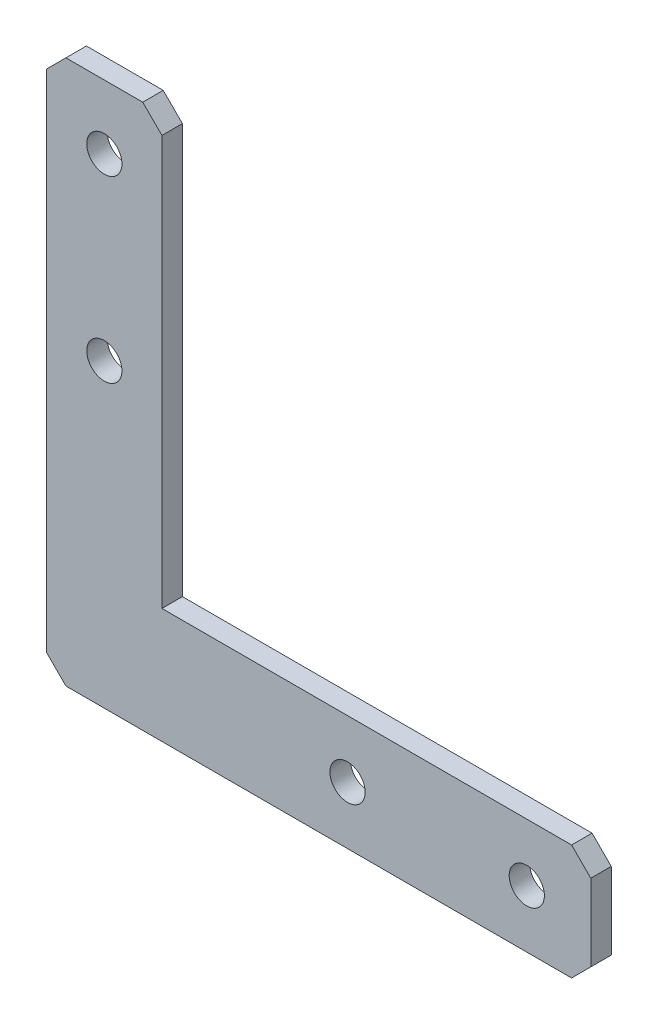
ISO-10303-21;
HEADER;
FILE_DESCRIPTION(('STEP AP214'),'2;1');
FILE_NAME('part.step','',(''),(''),'','','');
FILE_SCHEMA(('AUTOMOTIVE_DESIGN { 1 0 10303 214 1 1 1 1 }'));
ENDSEC;
DATA;
#1=APPLICATION_CONTEXT('core data for automotive mechanical design processes');
#2=APPLICATION_PROTOCOL_DEFINITION('international standard','automotive_design',2000,#1);
#3=PRODUCT_CONTEXT('',#1,'mechanical');
#4=PRODUCT('Part','Part','',(#3));
#5=PRODUCT_RELATED_PRODUCT_CATEGORY('part','',(#4));
#6=PRODUCT_DEFINITION_FORMATION('','',#4);
#7=PRODUCT_DEFINITION_CONTEXT('part definition',#1,'design');
#8=PRODUCT_DEFINITION('design','',#6,#7);
#9=PRODUCT_DEFINITION_SHAPE('','',#8);
#10=(LENGTH_UNIT() NAMED_UNIT(*) SI_UNIT(.MILLI.,.METRE.));
#11=(NAMED_UNIT(*) PLANE_ANGLE_UNIT() SI_UNIT($,.RADIAN.));
#12=(NAMED_UNIT(*) SI_UNIT($,.STERADIAN.) SOLID_ANGLE_UNIT());
#13=UNCERTAINTY_MEASURE_WITH_UNIT(LENGTH_MEASURE(1.E-05),#10,'distance_accuracy_value','');
#14=(GEOMETRIC_REPRESENTATION_CONTEXT(3) GLOBAL_UNCERTAINTY_ASSIGNED_CONTEXT((#13)) GLOBAL_UNIT_ASSIGNED_CONTEXT((#10,
#11,#12)) REPRESENTATION_CONTEXT('',''));
#15=CARTESIAN_POINT('',(0.,0.,0.));
#16=DIRECTION('',(0.,0.,1.));
#17=DIRECTION('',(1.,0.,0.));
#18=AXIS2_PLACEMENT_3D('',#15,#16,#17);
#19=CARTESIAN_POINT('',(3.,85.,-3.2));
#20=DIRECTION('',(-0.707106781186548,0.707106781186547,0.));
#21=DIRECTION('',(-0.707106781186547,-0.707106781186548,0.));
#22=AXIS2_PLACEMENT_3D('',#19,#20,#21);
#23=PLANE('',#22);
#24=DIRECTION('',(-0.707106781186547,-0.707106781186548,0.));
#25=VECTOR('',#24,1.);
#26=CARTESIAN_POINT('',(3.,85.,0.));
#27=LINE('',#26,#25);
#28=CARTESIAN_POINT('',(3.,85.,0.));
#29=VERTEX_POINT('',#28);
#30=CARTESIAN_POINT('',(0.,82.,0.));
#31=VERTEX_POINT('',#30);
#32=EDGE_CURVE('E148',#29,#31,#27,.T.);
#33=ORIENTED_EDGE('',*,*,#32,.F.);
#34=DIRECTION('',(0.,0.,1.));
#35=VECTOR('',#34,1.);
#36=CARTESIAN_POINT('',(3.,85.,-3.2));
#37=LINE('',#36,#35);
#38=CARTESIAN_POINT('',(3.,85.,-3.2));
#39=VERTEX_POINT('',#38);
#40=EDGE_CURVE('E11',#39,#29,#37,.T.);
#41=ORIENTED_EDGE('',*,*,#40,.F.);
#42=DIRECTION('',(-0.707106781186547,-0.707106781186548,0.));
#43=VECTOR('',#42,1.);
#44=CARTESIAN_POINT('',(3.,85.,-3.2));
#45=LINE('',#44,#43);
#46=CARTESIAN_POINT('',(0.,82.,-3.2));
#47=VERTEX_POINT('',#46);
#48=EDGE_CURVE('E178',#39,#47,#45,.T.);
#49=ORIENTED_EDGE('',*,*,#48,.T.);
#50=DIRECTION('',(0.,0.,1.));
#51=VECTOR('',#50,1.);
#52=CARTESIAN_POINT('',(0.,82.,-3.2));
#53=LINE('',#52,#51);
#54=EDGE_CURVE('E36',#47,#31,#53,.T.);
#55=ORIENTED_EDGE('',*,*,#54,.T.);
#56=EDGE_LOOP('',(#33,#41,#49,#55));
#57=FACE_BOUND('',#56,.T.);
#58=ADVANCED_FACE('F33',(#57),#23,.T.);
#59=CARTESIAN_POINT('',(15.,85.,-3.2));
#60=DIRECTION('',(0.,1.,0.));
#61=DIRECTION('',(0.,0.,1.));
#62=AXIS2_PLACEMENT_3D('',#59,#60,#61);
#63=PLANE('',#62);
#64=DIRECTION('',(-1.,0.,0.));
#65=VECTOR('',#64,1.);
#66=CARTESIAN_POINT('',(15.,85.,0.));
#67=LINE('',#66,#65);
#68=CARTESIAN_POINT('',(15.,85.,0.));
#69=VERTEX_POINT('',#68);
#70=EDGE_CURVE('E176',#69,#29,#67,.T.);
#71=ORIENTED_EDGE('',*,*,#70,.F.);
#72=DIRECTION('',(0.,0.,1.));
#73=VECTOR('',#72,1.);
#74=CARTESIAN_POINT('',(15.,85.,-3.2));
#75=LINE('',#74,#73);
#76=CARTESIAN_POINT('',(15.,85.,-3.2));
#77=VERTEX_POINT('',#76);
#78=EDGE_CURVE('E42',#77,#69,#75,.T.);
#79=ORIENTED_EDGE('',*,*,#78,.F.);
#80=DIRECTION('',(-1.,0.,0.));
#81=VECTOR('',#80,1.);
#82=CARTESIAN_POINT('',(15.,85.,-3.2));
#83=LINE('',#82,#81);
#84=EDGE_CURVE('E138',#77,#39,#83,.T.);
#85=ORIENTED_EDGE('',*,*,#84,.T.);
#86=ORIENTED_EDGE('',*,*,#40,.T.);
#87=EDGE_LOOP('',(#71,#79,#85,#86));
#88=FACE_BOUND('',#87,.T.);
#89=ADVANCED_FACE('F196',(#88),#63,.T.);
#90=CARTESIAN_POINT('',(18.,82.,-3.2));
#91=DIRECTION('',(0.707106781186548,0.707106781186547,0.));
#92=DIRECTION('',(-0.707106781186547,0.707106781186548,0.));
#93=AXIS2_PLACEMENT_3D('',#90,#91,#92);
#94=PLANE('',#93);
#95=DIRECTION('',(-0.707106781186547,0.707106781186548,0.));
#96=VECTOR('',#95,1.);
#97=CARTESIAN_POINT('',(18.,82.,0.));
#98=LINE('',#97,#96);
#99=CARTESIAN_POINT('',(18.,82.,0.));
#100=VERTEX_POINT('',#99);
#101=EDGE_CURVE('E125',#100,#69,#98,.T.);
#102=ORIENTED_EDGE('',*,*,#101,.F.);
#103=DIRECTION('',(0.,0.,1.));
#104=VECTOR('',#103,1.);
#105=CARTESIAN_POINT('',(18.,82.,-3.2));
#106=LINE('',#105,#104);
#107=CARTESIAN_POINT('',(18.,82.,-3.2));
#108=VERTEX_POINT('',#107);
#109=EDGE_CURVE('E120',#108,#100,#106,.T.);
#110=ORIENTED_EDGE('',*,*,#109,.F.);
#111=DIRECTION('',(-0.707106781186547,0.707106781186548,0.));
#112=VECTOR('',#111,1.);
#113=CARTESIAN_POINT('',(18.,82.,-3.2));
#114=LINE('',#113,#112);
#115=EDGE_CURVE('E123',#108,#77,#114,.T.);
#116=ORIENTED_EDGE('',*,*,#115,.T.);
#117=ORIENTED_EDGE('',*,*,#78,.T.);
#118=EDGE_LOOP('',(#102,#110,#116,#117));
#119=FACE_BOUND('',#118,.T.);
#120=ADVANCED_FACE('F122',(#119),#94,.T.);
#121=CARTESIAN_POINT('',(18.,18.,-3.2));
#122=DIRECTION('',(1.,0.,0.));
#123=DIRECTION('',(0.,0.,-1.));
#124=AXIS2_PLACEMENT_3D('',#121,#122,#123);
#125=PLANE('',#124);
#126=DIRECTION('',(0.,1.,0.));
#127=VECTOR('',#126,1.);
#128=CARTESIAN_POINT('',(18.,18.,0.));
#129=LINE('',#128,#127);
#130=CARTESIAN_POINT('',(18.,18.,0.));
#131=VERTEX_POINT('',#130);
#132=EDGE_CURVE('E173',#131,#100,#129,.T.);
#133=ORIENTED_EDGE('',*,*,#132,.F.);
#134=DIRECTION('',(0.,0.,1.));
#135=VECTOR('',#134,1.);
#136=CARTESIAN_POINT('',(18.,18.,-3.2));
#137=LINE('',#136,#135);
#138=CARTESIAN_POINT('',(18.,18.,-3.2));
#139=VERTEX_POINT('',#138);
#140=EDGE_CURVE('E130',#139,#131,#137,.T.);
#141=ORIENTED_EDGE('',*,*,#140,.F.);
#142=DIRECTION('',(0.,1.,0.));
#143=VECTOR('',#142,1.);
#144=CARTESIAN_POINT('',(18.,18.,-3.2));
#145=LINE('',#144,#143);
#146=EDGE_CURVE('E136',#139,#108,#145,.T.);
#147=ORIENTED_EDGE('',*,*,#146,.T.);
#148=ORIENTED_EDGE('',*,*,#109,.T.);
#149=EDGE_LOOP('',(#133,#141,#147,#148));
#150=FACE_BOUND('',#149,.T.);
#151=ADVANCED_FACE('F140',(#150),#125,.T.);
#152=CARTESIAN_POINT('',(82.,18.,-3.2));
#153=DIRECTION('',(0.,1.,0.));
#154=DIRECTION('',(0.,0.,1.));
#155=AXIS2_PLACEMENT_3D('',#152,#153,#154);
#156=PLANE('',#155);
#157=DIRECTION('',(-1.,0.,0.));
#158=VECTOR('',#157,1.);
#159=CARTESIAN_POINT('',(82.,18.,0.));
#160=LINE('',#159,#158);
#161=CARTESIAN_POINT('',(82.,18.,0.));
#162=VERTEX_POINT('',#161);
#163=EDGE_CURVE('E170',#162,#131,#160,.T.);
#164=ORIENTED_EDGE('',*,*,#163,.F.);
#165=DIRECTION('',(0.,0.,1.));
#166=VECTOR('',#165,1.);
#167=CARTESIAN_POINT('',(82.,18.,-3.2));
#168=LINE('',#167,#166);
#169=CARTESIAN_POINT('',(82.,18.,-3.2));
#170=VERTEX_POINT('',#169);
#171=EDGE_CURVE('E182',#170,#162,#168,.T.);
#172=ORIENTED_EDGE('',*,*,#171,.F.);
#173=DIRECTION('',(-1.,0.,0.));
#174=VECTOR('',#173,1.);
#175=CARTESIAN_POINT('',(82.,18.,-3.2));
#176=LINE('',#175,#174);
#177=EDGE_CURVE('E141',#170,#139,#176,.T.);
#178=ORIENTED_EDGE('',*,*,#177,.T.);
#179=ORIENTED_EDGE('',*,*,#140,.T.);
#180=EDGE_LOOP('',(#164,#172,#178,#179));
#181=FACE_BOUND('',#180,.T.);
#182=ADVANCED_FACE('F209',(#181),#156,.T.);
#183=CARTESIAN_POINT('',(85.,15.,-3.2));
#184=DIRECTION('',(0.707106781186547,0.707106781186548,0.));
#185=DIRECTION('',(-0.707106781186548,0.707106781186547,0.));
#186=AXIS2_PLACEMENT_3D('',#183,#184,#185);
#187=PLANE('',#186);
#188=DIRECTION('',(-0.707106781186548,0.707106781186547,0.));
#189=VECTOR('',#188,1.);
#190=CARTESIAN_POINT('',(85.,15.,0.));
#191=LINE('',#190,#189);
#192=CARTESIAN_POINT('',(85.,15.,0.));
#193=VERTEX_POINT('',#192);
#194=EDGE_CURVE('E167',#193,#162,#191,.T.);
#195=ORIENTED_EDGE('',*,*,#194,.F.);
#196=DIRECTION('',(0.,0.,1.));
#197=VECTOR('',#196,1.);
#198=CARTESIAN_POINT('',(85.,15.,-3.2));
#199=LINE('',#198,#197);
#200=CARTESIAN_POINT('',(85.,15.,-3.2));
#201=VERTEX_POINT('',#200);
#202=EDGE_CURVE('E184',#201,#193,#199,.T.);
#203=ORIENTED_EDGE('',*,*,#202,.F.);
#204=DIRECTION('',(-0.707106781186548,0.707106781186547,0.));
#205=VECTOR('',#204,1.);
#206=CARTESIAN_POINT('',(85.,15.,-3.2));
#207=LINE('',#206,#205);
#208=EDGE_CURVE('E143',#201,#170,#207,.T.);
#209=ORIENTED_EDGE('',*,*,#208,.T.);
#210=ORIENTED_EDGE('',*,*,#171,.T.);
#211=EDGE_LOOP('',(#195,#203,#209,#210));
#212=FACE_BOUND('',#211,.T.);
#213=ADVANCED_FACE('F212',(#212),#187,.T.);
#214=CARTESIAN_POINT('',(85.,3.,-3.2));
#215=DIRECTION('',(1.,0.,0.));
#216=DIRECTION('',(0.,0.,-1.));
#217=AXIS2_PLACEMENT_3D('',#214,#215,#216);
#218=PLANE('',#217);
#219=DIRECTION('',(0.,1.,0.));
#220=VECTOR('',#219,1.);
#221=CARTESIAN_POINT('',(85.,3.,0.));
#222=LINE('',#221,#220);
#223=CARTESIAN_POINT('',(85.,3.,0.));
#224=VERTEX_POINT('',#223);
#225=EDGE_CURVE('E164',#224,#193,#222,.T.);
#226=ORIENTED_EDGE('',*,*,#225,.F.);
#227=DIRECTION('',(0.,0.,1.));
#228=VECTOR('',#227,1.);
#229=CARTESIAN_POINT('',(85.,3.,-3.2));
#230=LINE('',#229,#228);
#231=CARTESIAN_POINT('',(85.,3.,-3.2));
#232=VERTEX_POINT('',#231);
#233=EDGE_CURVE('E186',#232,#224,#230,.T.);
#234=ORIENTED_EDGE('',*,*,#233,.F.);
#235=DIRECTION('',(0.,1.,0.));
#236=VECTOR('',#235,1.);
#237=CARTESIAN_POINT('',(85.,3.,-3.2));
#238=LINE('',#237,#236);
#239=EDGE_CURVE('E299',#232,#201,#238,.T.);
#240=ORIENTED_EDGE('',*,*,#239,.T.);
#241=ORIENTED_EDGE('',*,*,#202,.T.);
#242=EDGE_LOOP('',(#226,#234,#240,#241));
#243=FACE_BOUND('',#242,.T.);
#244=ADVANCED_FACE('F216',(#243),#218,.T.);
#245=CARTESIAN_POINT('',(82.,0.,-3.2));
#246=DIRECTION('',(0.707106781186547,-0.707106781186548,0.));
#247=DIRECTION('',(0.707106781186548,0.707106781186547,0.));
#248=AXIS2_PLACEMENT_3D('',#245,#246,#247);
#249=PLANE('',#248);
#250=DIRECTION('',(0.707106781186548,0.707106781186547,0.));
#251=VECTOR('',#250,1.);
#252=CARTESIAN_POINT('',(82.,0.,0.));
#253=LINE('',#252,#251);
#254=CARTESIAN_POINT('',(82.,0.,0.));
#255=VERTEX_POINT('',#254);
#256=EDGE_CURVE('E161',#255,#224,#253,.T.);
#257=ORIENTED_EDGE('',*,*,#256,.F.);
#258=DIRECTION('',(0.,0.,1.));
#259=VECTOR('',#258,1.);
#260=CARTESIAN_POINT('',(82.,0.,-3.2));
#261=LINE('',#260,#259);
#262=CARTESIAN_POINT('',(82.,0.,-3.2));
#263=VERTEX_POINT('',#262);
#264=EDGE_CURVE('E188',#263,#255,#261,.T.);
#265=ORIENTED_EDGE('',*,*,#264,.F.);
#266=DIRECTION('',(0.707106781186548,0.707106781186547,0.));
#267=VECTOR('',#266,1.);
#268=CARTESIAN_POINT('',(82.,0.,-3.2));
#269=LINE('',#268,#267);
#270=EDGE_CURVE('E296',#263,#232,#269,.T.);
#271=ORIENTED_EDGE('',*,*,#270,.T.);
#272=ORIENTED_EDGE('',*,*,#233,.T.);
#273=EDGE_LOOP('',(#257,#265,#271,#272));
#274=FACE_BOUND('',#273,.T.);
#275=ADVANCED_FACE('F220',(#274),#249,.T.);
#276=CARTESIAN_POINT('',(3.,0.,-3.2));
#277=DIRECTION('',(0.,-1.,0.));
#278=DIRECTION('',(0.,0.,-1.));
#279=AXIS2_PLACEMENT_3D('',#276,#277,#278);
#280=PLANE('',#279);
#281=DIRECTION('',(1.,0.,0.));
#282=VECTOR('',#281,1.);
#283=CARTESIAN_POINT('',(3.,0.,0.));
#284=LINE('',#283,#282);
#285=CARTESIAN_POINT('',(3.,0.,0.));
#286=VERTEX_POINT('',#285);
#287=EDGE_CURVE('E158',#286,#255,#284,.T.);
#288=ORIENTED_EDGE('',*,*,#287,.F.);
#289=DIRECTION('',(0.,0.,1.));
#290=VECTOR('',#289,1.);
#291=CARTESIAN_POINT('',(3.,0.,-3.2));
#292=LINE('',#291,#290);
#293=CARTESIAN_POINT('',(3.,0.,-3.2));
#294=VERTEX_POINT('',#293);
#295=EDGE_CURVE('E190',#294,#286,#292,.T.);
#296=ORIENTED_EDGE('',*,*,#295,.F.);
#297=DIRECTION('',(1.,0.,0.));
#298=VECTOR('',#297,1.);
#299=CARTESIAN_POINT('',(3.,0.,-3.2));
#300=LINE('',#299,#298);
#301=EDGE_CURVE('E293',#294,#263,#300,.T.);
#302=ORIENTED_EDGE('',*,*,#301,.T.);
#303=ORIENTED_EDGE('',*,*,#264,.T.);
#304=EDGE_LOOP('',(#288,#296,#302,#303));
#305=FACE_BOUND('',#304,.T.);
#306=ADVANCED_FACE('F224',(#305),#280,.T.);
#307=CARTESIAN_POINT('',(0.,3.,-3.2));
#308=DIRECTION('',(-0.707106781186548,-0.707106781186548,0.));
#309=DIRECTION('',(0.707106781186548,-0.707106781186548,0.));
#310=AXIS2_PLACEMENT_3D('',#307,#308,#309);
#311=PLANE('',#310);
#312=DIRECTION('',(0.707106781186548,-0.707106781186548,0.));
#313=VECTOR('',#312,1.);
#314=CARTESIAN_POINT('',(0.,3.,0.));
#315=LINE('',#314,#313);
#316=CARTESIAN_POINT('',(0.,3.,0.));
#317=VERTEX_POINT('',#316);
#318=EDGE_CURVE('E155',#317,#286,#315,.T.);
#319=ORIENTED_EDGE('',*,*,#318,.F.);
#320=DIRECTION('',(0.,0.,1.));
#321=VECTOR('',#320,1.);
#322=CARTESIAN_POINT('',(0.,3.,-3.2));
#323=LINE('',#322,#321);
#324=CARTESIAN_POINT('',(0.,3.,-3.2));
#325=VERTEX_POINT('',#324);
#326=EDGE_CURVE('E191',#325,#317,#323,.T.);
#327=ORIENTED_EDGE('',*,*,#326,.F.);
#328=DIRECTION('',(0.707106781186548,-0.707106781186548,0.));
#329=VECTOR('',#328,1.);
#330=CARTESIAN_POINT('',(0.,3.,-3.2));
#331=LINE('',#330,#329);
#332=EDGE_CURVE('E290',#325,#294,#331,.T.);
#333=ORIENTED_EDGE('',*,*,#332,.T.);
#334=ORIENTED_EDGE('',*,*,#295,.T.);
#335=EDGE_LOOP('',(#319,#327,#333,#334));
#336=FACE_BOUND('',#335,.T.);
#337=ADVANCED_FACE('F228',(#336),#311,.T.);
#338=CARTESIAN_POINT('',(0.,82.,-3.2));
#339=DIRECTION('',(-1.,0.,0.));
#340=DIRECTION('',(0.,0.,1.));
#341=AXIS2_PLACEMENT_3D('',#338,#339,#340);
#342=PLANE('',#341);
#343=DIRECTION('',(0.,-1.,0.));
#344=VECTOR('',#343,1.);
#345=CARTESIAN_POINT('',(0.,82.,0.));
#346=LINE('',#345,#344);
#347=EDGE_CURVE('E151',#31,#317,#346,.T.);
#348=ORIENTED_EDGE('',*,*,#347,.F.);
#349=ORIENTED_EDGE('',*,*,#54,.F.);
#350=DIRECTION('',(0.,-1.,0.));
#351=VECTOR('',#350,1.);
#352=CARTESIAN_POINT('',(0.,82.,-3.2));
#353=LINE('',#352,#351);
#354=EDGE_CURVE('E288',#47,#325,#353,.T.);
#355=ORIENTED_EDGE('',*,*,#354,.T.);
#356=ORIENTED_EDGE('',*,*,#326,.T.);
#357=EDGE_LOOP('',(#348,#349,#355,#356));
#358=FACE_BOUND('',#357,.T.);
#359=ADVANCED_FACE('F193',(#358),#342,.T.);
#360=CARTESIAN_POINT('',(0.,0.,-3.2));
#361=DIRECTION('',(0.,0.,1.));
#362=DIRECTION('',(1.,0.,0.));
#363=AXIS2_PLACEMENT_3D('',#360,#361,#362);
#364=PLANE('',#363);
#365=CARTESIAN_POINT('',(9.,75.,-3.2));
#366=DIRECTION('',(0.,0.,1.));
#367=DIRECTION('',(1.,0.,0.));
#368=AXIS2_PLACEMENT_3D('',#365,#366,#367);
#369=CIRCLE('',#368,2.75);
#370=CARTESIAN_POINT('',(11.75,75.,-3.2));
#371=VERTEX_POINT('',#370);
#372=EDGE_CURVE('E263',#371,#371,#369,.T.);
#373=ORIENTED_EDGE('',*,*,#372,.T.);
#374=EDGE_LOOP('',(#373));
#375=FACE_BOUND('',#374,.T.);
#376=CARTESIAN_POINT('',(9.,47.,-3.2));
#377=DIRECTION('',(0.,0.,1.));
#378=DIRECTION('',(1.,0.,0.));
#379=AXIS2_PLACEMENT_3D('',#376,#377,#378);
#380=CIRCLE('',#379,2.75);
#381=CARTESIAN_POINT('',(11.75,47.,-3.2));
#382=VERTEX_POINT('',#381);
#383=EDGE_CURVE('E271',#382,#382,#380,.T.);
#384=ORIENTED_EDGE('',*,*,#383,.T.);
#385=EDGE_LOOP('',(#384));
#386=FACE_BOUND('',#385,.T.);
#387=CARTESIAN_POINT('',(47.,9.,-3.2));
#388=DIRECTION('',(0.,0.,1.));
#389=DIRECTION('',(1.,0.,0.));
#390=AXIS2_PLACEMENT_3D('',#387,#388,#389);
#391=CIRCLE('',#390,2.75);
#392=CARTESIAN_POINT('',(49.75,9.,-3.2));
#393=VERTEX_POINT('',#392);
#394=EDGE_CURVE('E277',#393,#393,#391,.T.);
#395=ORIENTED_EDGE('',*,*,#394,.T.);
#396=EDGE_LOOP('',(#395));
#397=FACE_BOUND('',#396,.T.);
#398=CARTESIAN_POINT('',(75.,9.,-3.2));
#399=DIRECTION('',(0.,0.,1.));
#400=DIRECTION('',(1.,0.,0.));
#401=AXIS2_PLACEMENT_3D('',#398,#399,#400);
#402=CIRCLE('',#401,2.75);
#403=CARTESIAN_POINT('',(77.75,9.,-3.2));
#404=VERTEX_POINT('',#403);
#405=EDGE_CURVE('E152',#404,#404,#402,.T.);
#406=ORIENTED_EDGE('',*,*,#405,.T.);
#407=EDGE_LOOP('',(#406));
#408=FACE_BOUND('',#407,.T.);
#409=ORIENTED_EDGE('',*,*,#48,.F.);
#410=ORIENTED_EDGE('',*,*,#84,.F.);
#411=ORIENTED_EDGE('',*,*,#115,.F.);
#412=ORIENTED_EDGE('',*,*,#146,.F.);
#413=ORIENTED_EDGE('',*,*,#177,.F.);
#414=ORIENTED_EDGE('',*,*,#208,.F.);
#415=ORIENTED_EDGE('',*,*,#239,.F.);
#416=ORIENTED_EDGE('',*,*,#270,.F.);
#417=ORIENTED_EDGE('',*,*,#301,.F.);
#418=ORIENTED_EDGE('',*,*,#332,.F.);
#419=ORIENTED_EDGE('',*,*,#354,.F.);
#420=EDGE_LOOP('',(#409,#410,#411,#412,#413,#414,#415,#416,#417,#418,#419));
#421=FACE_BOUND('',#420,.T.);
#422=ADVANCED_FACE('F134',(#375,#386,#397,#408,#421),#364,.F.);
#423=CARTESIAN_POINT('',(0.,0.,0.));
#424=DIRECTION('',(0.,0.,1.));
#425=DIRECTION('',(1.,0.,0.));
#426=AXIS2_PLACEMENT_3D('',#423,#424,#425);
#427=PLANE('',#426);
#428=CARTESIAN_POINT('',(9.,75.,0.));
#429=DIRECTION('',(0.,0.,1.));
#430=DIRECTION('',(1.,0.,0.));
#431=AXIS2_PLACEMENT_3D('',#428,#429,#430);
#432=CIRCLE('',#431,2.75);
#433=CARTESIAN_POINT('',(11.75,75.,0.));
#434=VERTEX_POINT('',#433);
#435=EDGE_CURVE('E266',#434,#434,#432,.T.);
#436=ORIENTED_EDGE('',*,*,#435,.F.);
#437=EDGE_LOOP('',(#436));
#438=FACE_BOUND('',#437,.T.);
#439=CARTESIAN_POINT('',(9.,47.,0.));
#440=DIRECTION('',(0.,0.,1.));
#441=DIRECTION('',(1.,0.,0.));
#442=AXIS2_PLACEMENT_3D('',#439,#440,#441);
#443=CIRCLE('',#442,2.75);
#444=CARTESIAN_POINT('',(11.75,47.,0.));
#445=VERTEX_POINT('',#444);
#446=EDGE_CURVE('E268',#445,#445,#443,.T.);
#447=ORIENTED_EDGE('',*,*,#446,.F.);
#448=EDGE_LOOP('',(#447));
#449=FACE_BOUND('',#448,.T.);
#450=CARTESIAN_POINT('',(47.,9.,0.));
#451=DIRECTION('',(0.,0.,1.));
#452=DIRECTION('',(1.,0.,0.));
#453=AXIS2_PLACEMENT_3D('',#450,#451,#452);
#454=CIRCLE('',#453,2.75);
#455=CARTESIAN_POINT('',(49.75,9.,0.));
#456=VERTEX_POINT('',#455);
#457=EDGE_CURVE('E274',#456,#456,#454,.T.);
#458=ORIENTED_EDGE('',*,*,#457,.F.);
#459=EDGE_LOOP('',(#458));
#460=FACE_BOUND('',#459,.T.);
#461=CARTESIAN_POINT('',(75.,9.,0.));
#462=DIRECTION('',(0.,0.,1.));
#463=DIRECTION('',(1.,0.,0.));
#464=AXIS2_PLACEMENT_3D('',#461,#462,#463);
#465=CIRCLE('',#464,2.75);
#466=CARTESIAN_POINT('',(77.75,9.,0.));
#467=VERTEX_POINT('',#466);
#468=EDGE_CURVE('E280',#467,#467,#465,.T.);
#469=ORIENTED_EDGE('',*,*,#468,.F.);
#470=EDGE_LOOP('',(#469));
#471=FACE_BOUND('',#470,.T.);
#472=ORIENTED_EDGE('',*,*,#32,.T.);
#473=ORIENTED_EDGE('',*,*,#347,.T.);
#474=ORIENTED_EDGE('',*,*,#318,.T.);
#475=ORIENTED_EDGE('',*,*,#287,.T.);
#476=ORIENTED_EDGE('',*,*,#256,.T.);
#477=ORIENTED_EDGE('',*,*,#225,.T.);
#478=ORIENTED_EDGE('',*,*,#194,.T.);
#479=ORIENTED_EDGE('',*,*,#163,.T.);
#480=ORIENTED_EDGE('',*,*,#132,.T.);
#481=ORIENTED_EDGE('',*,*,#101,.T.);
#482=ORIENTED_EDGE('',*,*,#70,.T.);
#483=EDGE_LOOP('',(#472,#473,#474,#475,#476,#477,#478,#479,#480,#481,#482));
#484=FACE_BOUND('',#483,.T.);
#485=ADVANCED_FACE('F195',(#438,#449,#460,#471,#484),#427,.T.);
#486=CARTESIAN_POINT('',(75.,9.,-3.2));
#487=DIRECTION('',(0.,0.,1.));
#488=DIRECTION('',(1.,0.,0.));
#489=AXIS2_PLACEMENT_3D('',#486,#487,#488);
#490=CYLINDRICAL_SURFACE('',#489,2.75);
#491=ORIENTED_EDGE('',*,*,#405,.F.);
#492=EDGE_LOOP('',(#491));
#493=FACE_BOUND('',#492,.T.);
#494=ORIENTED_EDGE('',*,*,#468,.T.);
#495=EDGE_LOOP('',(#494));
#496=FACE_BOUND('',#495,.T.);
#497=ADVANCED_FACE('F240',(#493,#496),#490,.F.);
#498=CARTESIAN_POINT('',(47.,9.,-3.2));
#499=DIRECTION('',(0.,0.,1.));
#500=DIRECTION('',(1.,0.,0.));
#501=AXIS2_PLACEMENT_3D('',#498,#499,#500);
#502=CYLINDRICAL_SURFACE('',#501,2.75);
#503=ORIENTED_EDGE('',*,*,#394,.F.);
#504=EDGE_LOOP('',(#503));
#505=FACE_BOUND('',#504,.T.);
#506=ORIENTED_EDGE('',*,*,#457,.T.);
#507=EDGE_LOOP('',(#506));
#508=FACE_BOUND('',#507,.T.);
#509=ADVANCED_FACE('F247',(#505,#508),#502,.F.);
#510=CARTESIAN_POINT('',(9.,47.,-3.2));
#511=DIRECTION('',(0.,0.,1.));
#512=DIRECTION('',(1.,0.,0.));
#513=AXIS2_PLACEMENT_3D('',#510,#511,#512);
#514=CYLINDRICAL_SURFACE('',#513,2.75);
#515=ORIENTED_EDGE('',*,*,#383,.F.);
#516=EDGE_LOOP('',(#515));
#517=FACE_BOUND('',#516,.T.);
#518=ORIENTED_EDGE('',*,*,#446,.T.);
#519=EDGE_LOOP('',(#518));
#520=FACE_BOUND('',#519,.T.);
#521=ADVANCED_FACE('F251',(#517,#520),#514,.F.);
#522=CARTESIAN_POINT('',(9.,75.,-3.2));
#523=DIRECTION('',(0.,0.,1.));
#524=DIRECTION('',(1.,0.,0.));
#525=AXIS2_PLACEMENT_3D('',#522,#523,#524);
#526=CYLINDRICAL_SURFACE('',#525,2.75);
#527=ORIENTED_EDGE('',*,*,#372,.F.);
#528=EDGE_LOOP('',(#527));
#529=FACE_BOUND('',#528,.T.);
#530=ORIENTED_EDGE('',*,*,#435,.T.);
#531=EDGE_LOOP('',(#530));
#532=FACE_BOUND('',#531,.T.);
#533=ADVANCED_FACE('F255',(#529,#532),#526,.F.);
#534=CLOSED_SHELL('',(#58,#89,#120,#151,#182,#213,#244,#275,#306,#337,#359,#422,#485,#497,#509,
#521,#533));
#535=MANIFOLD_SOLID_BREP('B2',#534);
#536=ADVANCED_BREP_SHAPE_REPRESENTATION('',(#18,#535),#14);
#537=SHAPE_DEFINITION_REPRESENTATION(#9,#536);
ENDSEC;
END-ISO-10303-21;
